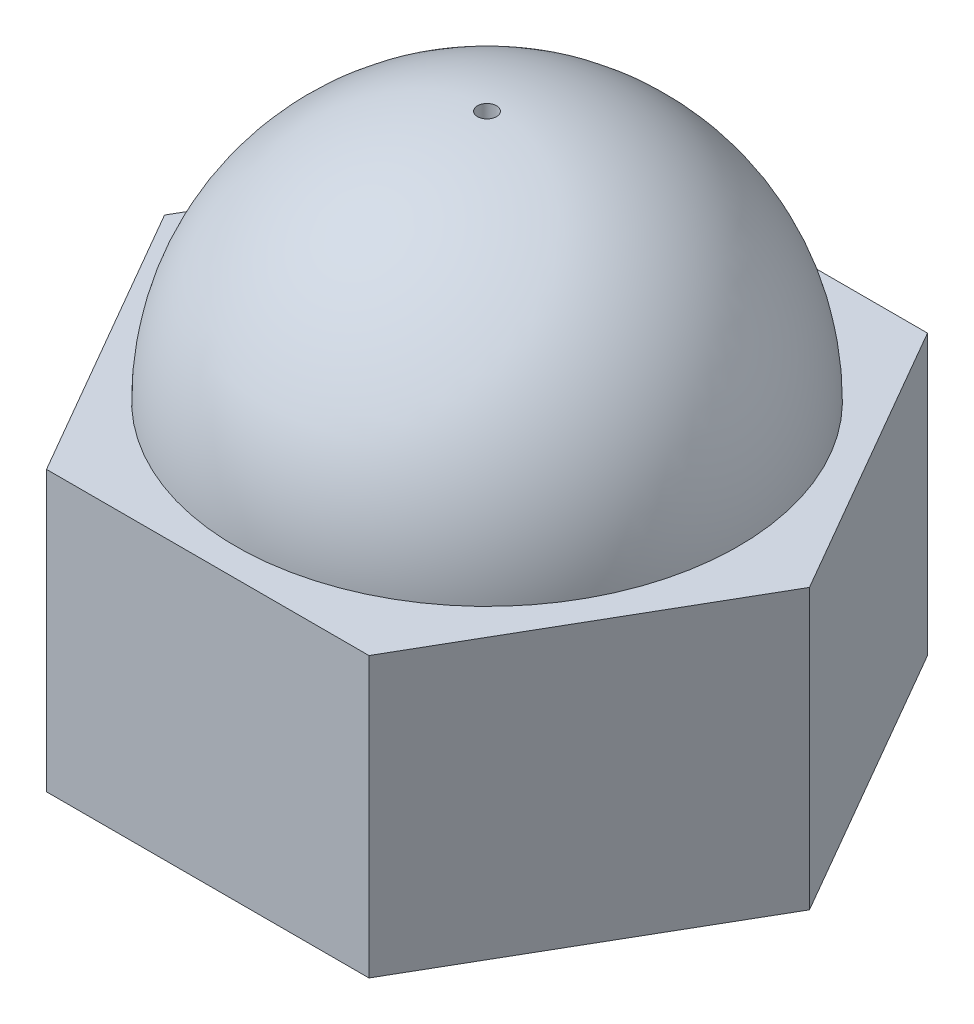
ISO-10303-21;
HEADER;
FILE_DESCRIPTION(('STEP AP214'),'2;1');
FILE_NAME('part.step','',(''),(''),'','','');
FILE_SCHEMA(('AUTOMOTIVE_DESIGN { 1 0 10303 214 1 1 1 1 }'));
ENDSEC;
DATA;
#1=APPLICATION_CONTEXT('core data for automotive mechanical design processes');
#2=APPLICATION_PROTOCOL_DEFINITION('international standard','automotive_design',2000,#1);
#3=PRODUCT_CONTEXT('',#1,'mechanical');
#4=PRODUCT('Part','Part','',(#3));
#5=PRODUCT_RELATED_PRODUCT_CATEGORY('part','',(#4));
#6=PRODUCT_DEFINITION_FORMATION('','',#4);
#7=PRODUCT_DEFINITION_CONTEXT('part definition',#1,'design');
#8=PRODUCT_DEFINITION('design','',#6,#7);
#9=PRODUCT_DEFINITION_SHAPE('','',#8);
#10=(LENGTH_UNIT() NAMED_UNIT(*) SI_UNIT(.MILLI.,.METRE.));
#11=(NAMED_UNIT(*) PLANE_ANGLE_UNIT() SI_UNIT($,.RADIAN.));
#12=(NAMED_UNIT(*) SI_UNIT($,.STERADIAN.) SOLID_ANGLE_UNIT());
#13=UNCERTAINTY_MEASURE_WITH_UNIT(LENGTH_MEASURE(1.E-05),#10,'distance_accuracy_value','');
#14=(GEOMETRIC_REPRESENTATION_CONTEXT(3) GLOBAL_UNCERTAINTY_ASSIGNED_CONTEXT((#13)) GLOBAL_UNIT_ASSIGNED_CONTEXT((#10,
#11,#12)) REPRESENTATION_CONTEXT('',''));
#15=CARTESIAN_POINT('',(0.,0.,0.));
#16=DIRECTION('',(0.,0.,1.));
#17=DIRECTION('',(1.,0.,0.));
#18=AXIS2_PLACEMENT_3D('',#15,#16,#17);
#19=CARTESIAN_POINT('',(5.77350269189625,5.,0.));
#20=DIRECTION('',(0.,1.,0.));
#21=DIRECTION('',(0.,0.,1.));
#22=AXIS2_PLACEMENT_3D('',#19,#20,#21);
#23=PLANE('',#22);
#24=DIRECTION('',(0.5,0.,-0.866025403784439));
#25=VECTOR('',#24,1.);
#26=CARTESIAN_POINT('',(2.88675134594812,5.,5.));
#27=LINE('',#26,#25);
#28=CARTESIAN_POINT('',(2.88675134594812,5.,5.));
#29=VERTEX_POINT('',#28);
#30=CARTESIAN_POINT('',(5.77350269189625,5.,0.));
#31=VERTEX_POINT('',#30);
#32=EDGE_CURVE('E132',#29,#31,#27,.T.);
#33=ORIENTED_EDGE('',*,*,#32,.T.);
#34=DIRECTION('',(-0.5,0.,-0.866025403784439));
#35=VECTOR('',#34,1.);
#36=CARTESIAN_POINT('',(5.77350269189625,5.,0.));
#37=LINE('',#36,#35);
#38=CARTESIAN_POINT('',(2.88675134594812,5.,-5.));
#39=VERTEX_POINT('',#38);
#40=EDGE_CURVE('E90',#31,#39,#37,.T.);
#41=ORIENTED_EDGE('',*,*,#40,.T.);
#42=DIRECTION('',(-1.,0.,0.));
#43=VECTOR('',#42,1.);
#44=CARTESIAN_POINT('',(2.88675134594812,5.,-5.));
#45=LINE('',#44,#43);
#46=CARTESIAN_POINT('',(-2.88675134594813,5.,-5.));
#47=VERTEX_POINT('',#46);
#48=EDGE_CURVE('E103',#39,#47,#45,.T.);
#49=ORIENTED_EDGE('',*,*,#48,.T.);
#50=DIRECTION('',(-0.5,0.,0.866025403784439));
#51=VECTOR('',#50,1.);
#52=CARTESIAN_POINT('',(-2.88675134594813,5.,-5.));
#53=LINE('',#52,#51);
#54=CARTESIAN_POINT('',(-5.77350269189626,5.,0.));
#55=VERTEX_POINT('',#54);
#56=EDGE_CURVE('E97',#47,#55,#53,.T.);
#57=ORIENTED_EDGE('',*,*,#56,.T.);
#58=DIRECTION('',(0.5,0.,0.866025403784439));
#59=VECTOR('',#58,1.);
#60=CARTESIAN_POINT('',(-5.77350269189626,5.,0.));
#61=LINE('',#60,#59);
#62=CARTESIAN_POINT('',(-2.88675134594813,5.,5.));
#63=VERTEX_POINT('',#62);
#64=EDGE_CURVE('E101',#55,#63,#61,.T.);
#65=ORIENTED_EDGE('',*,*,#64,.T.);
#66=DIRECTION('',(1.,0.,0.));
#67=VECTOR('',#66,1.);
#68=CARTESIAN_POINT('',(-2.88675134594813,5.,5.));
#69=LINE('',#68,#67);
#70=EDGE_CURVE('E52',#63,#29,#69,.T.);
#71=ORIENTED_EDGE('',*,*,#70,.T.);
#72=EDGE_LOOP('',(#33,#41,#49,#57,#65,#71));
#73=FACE_BOUND('',#72,.T.);
#74=CARTESIAN_POINT('',(0.,5.,0.));
#75=DIRECTION('',(0.,-1.,0.));
#76=DIRECTION('',(0.,0.,-1.));
#77=AXIS2_PLACEMENT_3D('',#74,#75,#76);
#78=CIRCLE('',#77,4.5);
#79=CARTESIAN_POINT('',(0.,5.,-4.5));
#80=VERTEX_POINT('',#79);
#81=EDGE_CURVE('E125',#80,#80,#78,.T.);
#82=ORIENTED_EDGE('',*,*,#81,.T.);
#83=EDGE_LOOP('',(#82));
#84=FACE_BOUND('',#83,.T.);
#85=ADVANCED_FACE('F35',(#73,#84),#23,.T.);
#86=CARTESIAN_POINT('',(2.88675134594812,5.,5.));
#87=DIRECTION('',(-0.866025403784439,0.,-0.5));
#88=DIRECTION('',(-0.5,0.,0.866025403784439));
#89=AXIS2_PLACEMENT_3D('',#86,#87,#88);
#90=PLANE('',#89);
#91=DIRECTION('',(0.5,0.,-0.866025403784439));
#92=VECTOR('',#91,1.);
#93=CARTESIAN_POINT('',(2.88675134594812,0.,5.));
#94=LINE('',#93,#92);
#95=CARTESIAN_POINT('',(2.88675134594812,0.,5.));
#96=VERTEX_POINT('',#95);
#97=CARTESIAN_POINT('',(5.77350269189625,0.,0.));
#98=VERTEX_POINT('',#97);
#99=EDGE_CURVE('E121',#96,#98,#94,.T.);
#100=ORIENTED_EDGE('',*,*,#99,.T.);
#101=DIRECTION('',(0.,-1.,0.));
#102=VECTOR('',#101,1.);
#103=CARTESIAN_POINT('',(5.77350269189625,5.,0.));
#104=LINE('',#103,#102);
#105=EDGE_CURVE('E139',#31,#98,#104,.T.);
#106=ORIENTED_EDGE('',*,*,#105,.F.);
#107=ORIENTED_EDGE('',*,*,#32,.F.);
#108=DIRECTION('',(0.,-1.,0.));
#109=VECTOR('',#108,1.);
#110=CARTESIAN_POINT('',(2.88675134594812,5.,5.));
#111=LINE('',#110,#109);
#112=EDGE_CURVE('E117',#29,#96,#111,.T.);
#113=ORIENTED_EDGE('',*,*,#112,.T.);
#114=EDGE_LOOP('',(#100,#106,#107,#113));
#115=FACE_BOUND('',#114,.T.);
#116=ADVANCED_FACE('F155',(#115),#90,.F.);
#117=CARTESIAN_POINT('',(5.77350269189625,5.,0.));
#118=DIRECTION('',(-0.866025403784438,0.,0.5));
#119=DIRECTION('',(0.5,0.,0.866025403784438));
#120=AXIS2_PLACEMENT_3D('',#117,#118,#119);
#121=PLANE('',#120);
#122=DIRECTION('',(-0.5,0.,-0.866025403784439));
#123=VECTOR('',#122,1.);
#124=CARTESIAN_POINT('',(5.77350269189625,0.,0.));
#125=LINE('',#124,#123);
#126=CARTESIAN_POINT('',(2.88675134594812,0.,-5.));
#127=VERTEX_POINT('',#126);
#128=EDGE_CURVE('E124',#98,#127,#125,.T.);
#129=ORIENTED_EDGE('',*,*,#128,.T.);
#130=DIRECTION('',(0.,-1.,0.));
#131=VECTOR('',#130,1.);
#132=CARTESIAN_POINT('',(2.88675134594812,5.,-5.));
#133=LINE('',#132,#131);
#134=EDGE_CURVE('E136',#39,#127,#133,.T.);
#135=ORIENTED_EDGE('',*,*,#134,.F.);
#136=ORIENTED_EDGE('',*,*,#40,.F.);
#137=ORIENTED_EDGE('',*,*,#105,.T.);
#138=EDGE_LOOP('',(#129,#135,#136,#137));
#139=FACE_BOUND('',#138,.T.);
#140=ADVANCED_FACE('F160',(#139),#121,.F.);
#141=CARTESIAN_POINT('',(2.88675134594812,5.,-5.));
#142=DIRECTION('',(0.,0.,1.));
#143=DIRECTION('',(1.,0.,0.));
#144=AXIS2_PLACEMENT_3D('',#141,#142,#143);
#145=PLANE('',#144);
#146=DIRECTION('',(-1.,0.,0.));
#147=VECTOR('',#146,1.);
#148=CARTESIAN_POINT('',(2.88675134594812,0.,-5.));
#149=LINE('',#148,#147);
#150=CARTESIAN_POINT('',(-2.88675134594813,0.,-5.));
#151=VERTEX_POINT('',#150);
#152=EDGE_CURVE('E127',#127,#151,#149,.T.);
#153=ORIENTED_EDGE('',*,*,#152,.T.);
#154=DIRECTION('',(0.,-1.,0.));
#155=VECTOR('',#154,1.);
#156=CARTESIAN_POINT('',(-2.88675134594813,5.,-5.));
#157=LINE('',#156,#155);
#158=EDGE_CURVE('E112',#47,#151,#157,.T.);
#159=ORIENTED_EDGE('',*,*,#158,.F.);
#160=ORIENTED_EDGE('',*,*,#48,.F.);
#161=ORIENTED_EDGE('',*,*,#134,.T.);
#162=EDGE_LOOP('',(#153,#159,#160,#161));
#163=FACE_BOUND('',#162,.T.);
#164=ADVANCED_FACE('F177',(#163),#145,.F.);
#165=CARTESIAN_POINT('',(-2.88675134594813,5.,-5.));
#166=DIRECTION('',(0.866025403784439,0.,0.5));
#167=DIRECTION('',(0.5,0.,-0.866025403784439));
#168=AXIS2_PLACEMENT_3D('',#165,#166,#167);
#169=PLANE('',#168);
#170=DIRECTION('',(-0.5,0.,0.866025403784439));
#171=VECTOR('',#170,1.);
#172=CARTESIAN_POINT('',(-2.88675134594813,0.,-5.));
#173=LINE('',#172,#171);
#174=CARTESIAN_POINT('',(-5.77350269189626,0.,0.));
#175=VERTEX_POINT('',#174);
#176=EDGE_CURVE('E111',#151,#175,#173,.T.);
#177=ORIENTED_EDGE('',*,*,#176,.T.);
#178=DIRECTION('',(0.,-1.,0.));
#179=VECTOR('',#178,1.);
#180=CARTESIAN_POINT('',(-5.77350269189626,5.,0.));
#181=LINE('',#180,#179);
#182=EDGE_CURVE('E108',#55,#175,#181,.T.);
#183=ORIENTED_EDGE('',*,*,#182,.F.);
#184=ORIENTED_EDGE('',*,*,#56,.F.);
#185=ORIENTED_EDGE('',*,*,#158,.T.);
#186=EDGE_LOOP('',(#177,#183,#184,#185));
#187=FACE_BOUND('',#186,.T.);
#188=ADVANCED_FACE('F109',(#187),#169,.F.);
#189=CARTESIAN_POINT('',(-5.77350269189626,5.,0.));
#190=DIRECTION('',(0.866025403784439,0.,-0.5));
#191=DIRECTION('',(-0.5,0.,-0.866025403784439));
#192=AXIS2_PLACEMENT_3D('',#189,#190,#191);
#193=PLANE('',#192);
#194=DIRECTION('',(0.5,0.,0.866025403784439));
#195=VECTOR('',#194,1.);
#196=CARTESIAN_POINT('',(-5.77350269189626,0.,0.));
#197=LINE('',#196,#195);
#198=CARTESIAN_POINT('',(-2.88675134594813,0.,5.));
#199=VERTEX_POINT('',#198);
#200=EDGE_CURVE('E75',#175,#199,#197,.T.);
#201=ORIENTED_EDGE('',*,*,#200,.T.);
#202=DIRECTION('',(0.,-1.,0.));
#203=VECTOR('',#202,1.);
#204=CARTESIAN_POINT('',(-2.88675134594813,5.,5.));
#205=LINE('',#204,#203);
#206=EDGE_CURVE('E113',#63,#199,#205,.T.);
#207=ORIENTED_EDGE('',*,*,#206,.F.);
#208=ORIENTED_EDGE('',*,*,#64,.F.);
#209=ORIENTED_EDGE('',*,*,#182,.T.);
#210=EDGE_LOOP('',(#201,#207,#208,#209));
#211=FACE_BOUND('',#210,.T.);
#212=ADVANCED_FACE('F115',(#211),#193,.F.);
#213=CARTESIAN_POINT('',(-2.88675134594813,5.,5.));
#214=DIRECTION('',(0.,0.,-1.));
#215=DIRECTION('',(-1.,0.,0.));
#216=AXIS2_PLACEMENT_3D('',#213,#214,#215);
#217=PLANE('',#216);
#218=DIRECTION('',(1.,0.,0.));
#219=VECTOR('',#218,1.);
#220=CARTESIAN_POINT('',(-2.88675134594813,0.,5.));
#221=LINE('',#220,#219);
#222=EDGE_CURVE('E81',#199,#96,#221,.T.);
#223=ORIENTED_EDGE('',*,*,#222,.T.);
#224=ORIENTED_EDGE('',*,*,#112,.F.);
#225=ORIENTED_EDGE('',*,*,#70,.F.);
#226=ORIENTED_EDGE('',*,*,#206,.T.);
#227=EDGE_LOOP('',(#223,#224,#225,#226));
#228=FACE_BOUND('',#227,.T.);
#229=ADVANCED_FACE('F169',(#228),#217,.F.);
#230=CARTESIAN_POINT('',(5.77350269189625,0.,0.));
#231=DIRECTION('',(0.,1.,0.));
#232=DIRECTION('',(0.,0.,1.));
#233=AXIS2_PLACEMENT_3D('',#230,#231,#232);
#234=PLANE('',#233);
#235=CARTESIAN_POINT('',(0.,0.,0.));
#236=DIRECTION('',(0.,-1.,0.));
#237=DIRECTION('',(0.,0.,-1.));
#238=AXIS2_PLACEMENT_3D('',#235,#236,#237);
#239=CIRCLE('',#238,3.);
#240=CARTESIAN_POINT('',(0.,0.,-3.));
#241=VERTEX_POINT('',#240);
#242=EDGE_CURVE('E195',#241,#241,#239,.T.);
#243=ORIENTED_EDGE('',*,*,#242,.F.);
#244=EDGE_LOOP('',(#243));
#245=FACE_BOUND('',#244,.T.);
#246=ORIENTED_EDGE('',*,*,#99,.F.);
#247=ORIENTED_EDGE('',*,*,#222,.F.);
#248=ORIENTED_EDGE('',*,*,#200,.F.);
#249=ORIENTED_EDGE('',*,*,#176,.F.);
#250=ORIENTED_EDGE('',*,*,#152,.F.);
#251=ORIENTED_EDGE('',*,*,#128,.F.);
#252=EDGE_LOOP('',(#246,#247,#248,#249,#250,#251));
#253=FACE_BOUND('',#252,.T.);
#254=ADVANCED_FACE('F166',(#245,#253),#234,.F.);
#255=CARTESIAN_POINT('',(0.,5.,0.));
#256=DIRECTION('',(0.,-1.,0.));
#257=DIRECTION('',(-1.,0.,0.));
#258=AXIS2_PLACEMENT_3D('',#255,#256,#257);
#259=SPHERICAL_SURFACE('',#258,4.5);
#260=CARTESIAN_POINT('',(0.,9.49678774237788,0.));
#261=DIRECTION('',(0.,-1.,0.));
#262=DIRECTION('',(0.,0.,-1.));
#263=AXIS2_PLACEMENT_3D('',#260,#261,#262);
#264=CIRCLE('',#263,0.17);
#265=CARTESIAN_POINT('',(0.,9.49678774237788,-0.17));
#266=VERTEX_POINT('',#265);
#267=EDGE_CURVE('E198',#266,#266,#264,.T.);
#268=ORIENTED_EDGE('',*,*,#267,.T.);
#269=EDGE_LOOP('',(#268));
#270=FACE_BOUND('',#269,.T.);
#271=ORIENTED_EDGE('',*,*,#81,.F.);
#272=EDGE_LOOP('',(#271));
#273=FACE_BOUND('',#272,.T.);
#274=ADVANCED_FACE('F164',(#270,#273),#259,.T.);
#275=CARTESIAN_POINT('',(0.,5.,0.));
#276=DIRECTION('',(0.,-1.,0.));
#277=DIRECTION('',(0.,0.,-1.));
#278=AXIS2_PLACEMENT_3D('',#275,#276,#277);
#279=CYLINDRICAL_SURFACE('',#278,3.);
#280=CARTESIAN_POINT('',(0.,5.,0.));
#281=DIRECTION('',(0.,-1.,0.));
#282=DIRECTION('',(0.,0.,-1.));
#283=AXIS2_PLACEMENT_3D('',#280,#281,#282);
#284=CIRCLE('',#283,3.);
#285=CARTESIAN_POINT('',(0.,5.,-3.));
#286=VERTEX_POINT('',#285);
#287=EDGE_CURVE('E194',#286,#286,#284,.T.);
#288=ORIENTED_EDGE('',*,*,#287,.F.);
#289=EDGE_LOOP('',(#288));
#290=FACE_BOUND('',#289,.T.);
#291=ORIENTED_EDGE('',*,*,#242,.T.);
#292=EDGE_LOOP('',(#291));
#293=FACE_BOUND('',#292,.T.);
#294=ADVANCED_FACE('F206',(#290,#293),#279,.F.);
#295=CARTESIAN_POINT('',(0.,5.,0.));
#296=DIRECTION('',(0.,-1.,0.));
#297=DIRECTION('',(0.,0.,-1.));
#298=AXIS2_PLACEMENT_3D('',#295,#296,#297);
#299=PLANE('',#298);
#300=CARTESIAN_POINT('',(0.,5.,0.));
#301=DIRECTION('',(0.,-1.,0.));
#302=DIRECTION('',(0.,0.,-1.));
#303=AXIS2_PLACEMENT_3D('',#300,#301,#302);
#304=CIRCLE('',#303,1.045);
#305=CARTESIAN_POINT('',(0.,5.,-1.045));
#306=VERTEX_POINT('',#305);
#307=EDGE_CURVE('E11',#306,#306,#304,.F.);
#308=ORIENTED_EDGE('',*,*,#307,.T.);
#309=EDGE_LOOP('',(#308));
#310=FACE_BOUND('',#309,.T.);
#311=ORIENTED_EDGE('',*,*,#287,.T.);
#312=EDGE_LOOP('',(#311));
#313=FACE_BOUND('',#312,.T.);
#314=ADVANCED_FACE('F151',(#310,#313),#299,.T.);
#315=CARTESIAN_POINT('',(0.,9.5,0.));
#316=DIRECTION('',(0.,-1.,0.));
#317=DIRECTION('',(0.,0.,-1.));
#318=AXIS2_PLACEMENT_3D('',#315,#316,#317);
#319=CYLINDRICAL_SURFACE('',#318,0.17);
#320=CARTESIAN_POINT('',(0.,7.00000000000002,0.));
#321=DIRECTION('',(0.,-1.,0.));
#322=DIRECTION('',(0.,0.,-1.));
#323=AXIS2_PLACEMENT_3D('',#320,#321,#322);
#324=CIRCLE('',#323,0.17);
#325=CARTESIAN_POINT('',(0.,7.00000000000002,-0.17));
#326=VERTEX_POINT('',#325);
#327=EDGE_CURVE('E44',#326,#326,#324,.T.);
#328=ORIENTED_EDGE('',*,*,#327,.T.);
#329=EDGE_LOOP('',(#328));
#330=FACE_BOUND('',#329,.T.);
#331=ORIENTED_EDGE('',*,*,#267,.F.);
#332=EDGE_LOOP('',(#331));
#333=FACE_BOUND('',#332,.T.);
#334=ADVANCED_FACE('F143',(#330,#333),#319,.F.);
#335=CARTESIAN_POINT('',(0.,7.00000000000002,0.));
#336=DIRECTION('',(0.,-1.,0.));
#337=DIRECTION('',(0.,0.,-1.));
#338=AXIS2_PLACEMENT_3D('',#335,#336,#337);
#339=CONICAL_SURFACE('',#338,0.17,0.412410441597385);
#340=CARTESIAN_POINT('',(0.,5.,-1.045));
#341=CARTESIAN_POINT('',(0.,5.02083333333333,-1.03588541666667));
#342=CARTESIAN_POINT('',(0.,5.04166666666667,-1.02677083333334));
#343=CARTESIAN_POINT('',(0.,5.08333333333333,-1.00854166666667));
#344=CARTESIAN_POINT('',(0.,5.10416666666667,-0.999427083333336));
#345=CARTESIAN_POINT('',(0.,5.14583333333333,-0.981197916666669));
#346=CARTESIAN_POINT('',(0.,5.16666666666667,-0.972083333333336));
#347=CARTESIAN_POINT('',(0.,5.20833333333334,-0.953854166666669));
#348=CARTESIAN_POINT('',(0.,5.22916666666667,-0.944739583333336));
#349=CARTESIAN_POINT('',(0.,5.27083333333334,-0.926510416666669));
#350=CARTESIAN_POINT('',(0.,5.29166666666667,-0.917395833333336));
#351=CARTESIAN_POINT('',(0.,5.33333333333334,-0.899166666666669));
#352=CARTESIAN_POINT('',(0.,5.35416666666667,-0.890052083333335));
#353=CARTESIAN_POINT('',(0.,5.39583333333334,-0.871822916666669));
#354=CARTESIAN_POINT('',(0.,5.41666666666667,-0.862708333333335));
#355=CARTESIAN_POINT('',(0.,5.45833333333334,-0.844479166666669));
#356=CARTESIAN_POINT('',(0.,5.47916666666667,-0.835364583333335));
#357=CARTESIAN_POINT('',(0.,5.52083333333334,-0.817135416666669));
#358=CARTESIAN_POINT('',(0.,5.54166666666667,-0.808020833333335));
#359=CARTESIAN_POINT('',(0.,5.58333333333334,-0.789791666666668));
#360=CARTESIAN_POINT('',(0.,5.60416666666667,-0.780677083333335));
#361=CARTESIAN_POINT('',(0.,5.64583333333334,-0.762447916666668));
#362=CARTESIAN_POINT('',(0.,5.66666666666667,-0.753333333333335));
#363=CARTESIAN_POINT('',(0.,5.70833333333334,-0.735104166666668));
#364=CARTESIAN_POINT('',(0.,5.72916666666667,-0.725989583333335));
#365=CARTESIAN_POINT('',(0.,5.77083333333334,-0.707760416666668));
#366=CARTESIAN_POINT('',(0.,5.79166666666667,-0.698645833333335));
#367=CARTESIAN_POINT('',(0.,5.83333333333334,-0.680416666666668));
#368=CARTESIAN_POINT('',(0.,5.85416666666667,-0.671302083333335));
#369=CARTESIAN_POINT('',(0.,5.89583333333334,-0.653072916666668));
#370=CARTESIAN_POINT('',(0.,5.91666666666667,-0.643958333333335));
#371=CARTESIAN_POINT('',(0.,5.95833333333334,-0.625729166666668));
#372=CARTESIAN_POINT('',(0.,5.97916666666667,-0.616614583333335));
#373=CARTESIAN_POINT('',(0.,6.02083333333334,-0.598385416666668));
#374=CARTESIAN_POINT('',(0.,6.04166666666668,-0.589270833333335));
#375=CARTESIAN_POINT('',(0.,6.08333333333334,-0.571041666666668));
#376=CARTESIAN_POINT('',(0.,6.10416666666668,-0.561927083333334));
#377=CARTESIAN_POINT('',(0.,6.14583333333334,-0.543697916666668));
#378=CARTESIAN_POINT('',(0.,6.16666666666668,-0.534583333333334));
#379=CARTESIAN_POINT('',(0.,6.20833333333334,-0.516354166666668));
#380=CARTESIAN_POINT('',(0.,6.22916666666668,-0.507239583333334));
#381=CARTESIAN_POINT('',(0.,6.27083333333334,-0.489010416666668));
#382=CARTESIAN_POINT('',(0.,6.29166666666668,-0.479895833333334));
#383=CARTESIAN_POINT('',(0.,6.33333333333335,-0.461666666666667));
#384=CARTESIAN_POINT('',(0.,6.35416666666668,-0.452552083333334));
#385=CARTESIAN_POINT('',(0.,6.39583333333335,-0.434322916666667));
#386=CARTESIAN_POINT('',(0.,6.41666666666668,-0.425208333333334));
#387=CARTESIAN_POINT('',(0.,6.45833333333335,-0.406979166666667));
#388=CARTESIAN_POINT('',(0.,6.47916666666668,-0.397864583333334));
#389=CARTESIAN_POINT('',(0.,6.52083333333335,-0.379635416666667));
#390=CARTESIAN_POINT('',(0.,6.54166666666668,-0.370520833333334));
#391=CARTESIAN_POINT('',(0.,6.58333333333335,-0.352291666666667));
#392=CARTESIAN_POINT('',(0.,6.60416666666668,-0.343177083333334));
#393=CARTESIAN_POINT('',(0.,6.64583333333335,-0.324947916666667));
#394=CARTESIAN_POINT('',(0.,6.66666666666668,-0.315833333333334));
#395=CARTESIAN_POINT('',(0.,6.70833333333335,-0.297604166666667));
#396=CARTESIAN_POINT('',(0.,6.72916666666668,-0.288489583333334));
#397=CARTESIAN_POINT('',(0.,6.77083333333335,-0.270260416666667));
#398=CARTESIAN_POINT('',(0.,6.79166666666668,-0.261145833333334));
#399=CARTESIAN_POINT('',(0.,6.83333333333335,-0.242916666666667));
#400=CARTESIAN_POINT('',(0.,6.85416666666668,-0.233802083333333));
#401=CARTESIAN_POINT('',(0.,6.89583333333335,-0.215572916666667));
#402=CARTESIAN_POINT('',(0.,6.91666666666668,-0.206458333333333));
#403=CARTESIAN_POINT('',(0.,6.95833333333335,-0.188229166666667));
#404=CARTESIAN_POINT('',(0.,6.97916666666668,-0.179114583333333));
#405=CARTESIAN_POINT('',(0.,7.00000000000002,-0.17));
#406=B_SPLINE_CURVE_WITH_KNOTS('',3,(#340,#341,#342,#343,#344,#345,#346,#347,#348,#349,#350,
#351,#352,#353,#354,#355,#356,#357,#358,#359,#360,#361,#362,#363,#364,#365,#366,#367,#368,#369,
#370,#371,#372,#373,#374,#375,#376,#377,#378,#379,#380,#381,#382,#383,#384,#385,#386,#387,#388,
#389,#390,#391,#392,#393,#394,#395,#396,#397,#398,#399,#400,#401,#402,#403,#404,#405),
.UNSPECIFIED.,.F.,.F.,(4,2,2,2,2,2,2,2,2,2,2,2,2,2,2,2,2,2,2,2,2,2,2,2,2,2,2,2,2,2,2,2,4),(0.,
0.0682197234241141,0.136439446848227,0.204659170272341,0.272878893696455,0.341098617120569,
0.409318340544682,0.477538063968796,0.54575778739291,0.613977510817024,0.682197234241138,
0.750416957665252,0.818636681089365,0.886856404513478,0.955076127937592,1.02329585136171,
1.09151557478582,1.15973529820993,1.22795502163405,1.29617474505816,1.36439446848227,
1.43261419190639,1.5008339153305,1.56905363875462,1.63727336217873,1.70549308560284,
1.77371280902696,1.84193253245107,1.91015225587519,1.9783719792993,2.04659170272341,
2.11481142614753,2.18303114957164),.UNSPECIFIED.);
#407=EDGE_CURVE('BSEAM37',#306,#326,#406,.T.);
#408=ORIENTED_EDGE('',*,*,#307,.F.);
#409=ORIENTED_EDGE('',*,*,#327,.F.);
#410=ORIENTED_EDGE('',*,*,#407,.T.);
#411=ORIENTED_EDGE('',*,*,#407,.F.);
#412=EDGE_LOOP('',(#408,#410,#409,#411));
#413=FACE_BOUND('',#412,.T.);
#414=ADVANCED_FACE('F37',(#413),#339,.F.);
#415=CLOSED_SHELL('',(#85,#116,#140,#164,#188,#212,#229,#254,#274,#294,#314,#334,#414));
#416=MANIFOLD_SOLID_BREP('B2',#415);
#417=ADVANCED_BREP_SHAPE_REPRESENTATION('',(#18,#416),#14);
#418=SHAPE_DEFINITION_REPRESENTATION(#9,#417);
ENDSEC;
END-ISO-10303-21;
